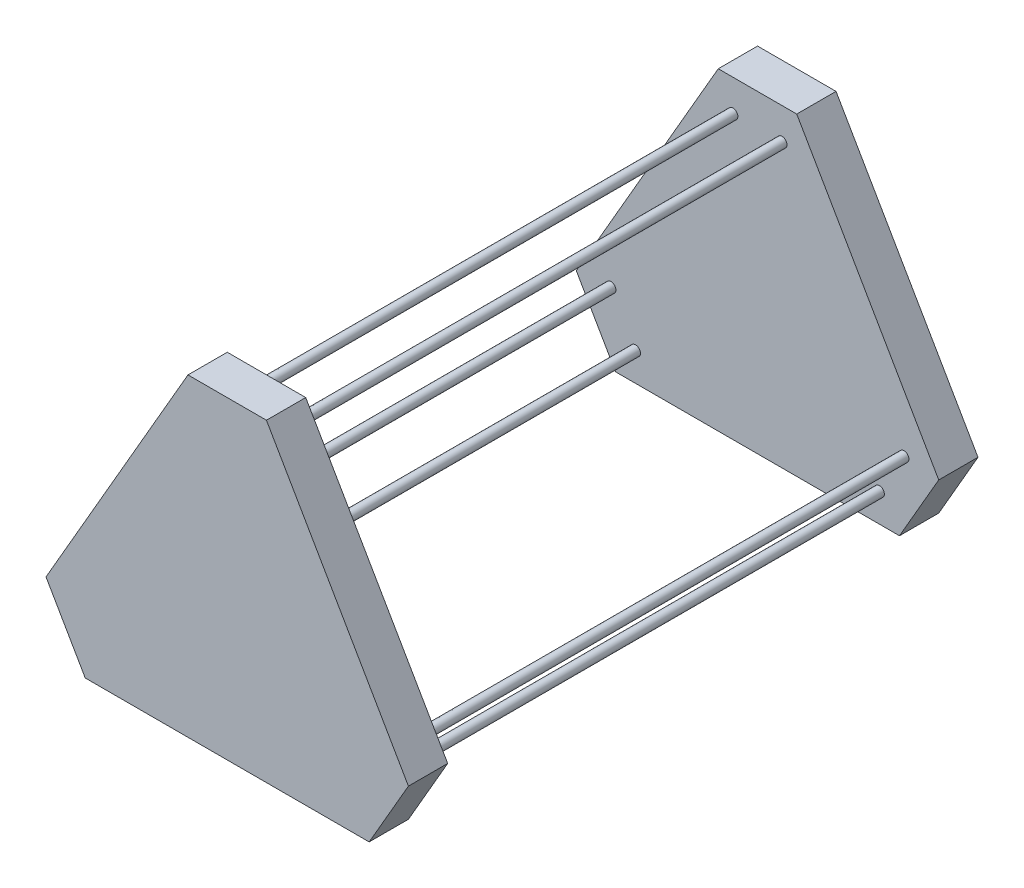
ISO-10303-21;
HEADER;
FILE_DESCRIPTION(('STEP AP214'),'2;1');
FILE_NAME('part.step','',(''),(''),'','','');
FILE_SCHEMA(('AUTOMOTIVE_DESIGN { 1 0 10303 214 1 1 1 1 }'));
ENDSEC;
DATA;
#1=APPLICATION_CONTEXT('core data for automotive mechanical design processes');
#2=APPLICATION_PROTOCOL_DEFINITION('international standard','automotive_design',2000,#1);
#3=PRODUCT_CONTEXT('',#1,'mechanical');
#4=PRODUCT('Part','Part','',(#3));
#5=PRODUCT_RELATED_PRODUCT_CATEGORY('part','',(#4));
#6=PRODUCT_DEFINITION_FORMATION('','',#4);
#7=PRODUCT_DEFINITION_CONTEXT('part definition',#1,'design');
#8=PRODUCT_DEFINITION('design','',#6,#7);
#9=PRODUCT_DEFINITION_SHAPE('','',#8);
#10=(LENGTH_UNIT() NAMED_UNIT(*) SI_UNIT(.MILLI.,.METRE.));
#11=(NAMED_UNIT(*) PLANE_ANGLE_UNIT() SI_UNIT($,.RADIAN.));
#12=(NAMED_UNIT(*) SI_UNIT($,.STERADIAN.) SOLID_ANGLE_UNIT());
#13=UNCERTAINTY_MEASURE_WITH_UNIT(LENGTH_MEASURE(1.E-05),#10,'distance_accuracy_value','');
#14=(GEOMETRIC_REPRESENTATION_CONTEXT(3) GLOBAL_UNCERTAINTY_ASSIGNED_CONTEXT((#13)) GLOBAL_UNIT_ASSIGNED_CONTEXT((#10,
#11,#12)) REPRESENTATION_CONTEXT('',''));
#15=CARTESIAN_POINT('',(0.,0.,0.));
#16=DIRECTION('',(0.,0.,1.));
#17=DIRECTION('',(1.,0.,0.));
#18=AXIS2_PLACEMENT_3D('',#15,#16,#17);
#19=CARTESIAN_POINT('',(-39.9523638439779,190.000000000007,-40.));
#20=DIRECTION('',(0.,1.,0.));
#21=DIRECTION('',(-1.,0.,0.));
#22=AXIS2_PLACEMENT_3D('',#19,#20,#21);
#23=PLANE('',#22);
#24=DIRECTION('',(-1.,0.,0.));
#25=VECTOR('',#24,1.);
#26=CARTESIAN_POINT('',(-39.9523638439779,190.000000000007,0.));
#27=LINE('',#26,#25);
#28=CARTESIAN_POINT('',(39.9523638439782,190.000000000007,0.));
#29=VERTEX_POINT('',#28);
#30=CARTESIAN_POINT('',(-39.9523638439779,190.000000000007,0.));
#31=VERTEX_POINT('',#30);
#32=EDGE_CURVE('E122',#29,#31,#27,.T.);
#33=ORIENTED_EDGE('',*,*,#32,.F.);
#34=DIRECTION('',(0.,0.,1.));
#35=VECTOR('',#34,1.);
#36=CARTESIAN_POINT('',(39.9523638439782,190.000000000007,-40.));
#37=LINE('',#36,#35);
#38=CARTESIAN_POINT('',(39.9523638439782,190.000000000007,-40.));
#39=VERTEX_POINT('',#38);
#40=EDGE_CURVE('E11',#39,#29,#37,.T.);
#41=ORIENTED_EDGE('',*,*,#40,.F.);
#42=DIRECTION('',(-1.,0.,0.));
#43=VECTOR('',#42,1.);
#44=CARTESIAN_POINT('',(-39.9523638439779,190.000000000007,-40.));
#45=LINE('',#44,#43);
#46=CARTESIAN_POINT('',(-39.9523638439779,190.000000000007,-40.));
#47=VERTEX_POINT('',#46);
#48=EDGE_CURVE('E137',#39,#47,#45,.T.);
#49=ORIENTED_EDGE('',*,*,#48,.T.);
#50=DIRECTION('',(0.,0.,1.));
#51=VECTOR('',#50,1.);
#52=CARTESIAN_POINT('',(-39.9523638439779,190.000000000007,-40.));
#53=LINE('',#52,#51);
#54=EDGE_CURVE('E36',#47,#31,#53,.T.);
#55=ORIENTED_EDGE('',*,*,#54,.T.);
#56=EDGE_LOOP('',(#33,#41,#49,#55));
#57=FACE_BOUND('',#56,.T.);
#58=ADVANCED_FACE('F33',(#57),#23,.T.);
#59=CARTESIAN_POINT('',(184.521008641038,-60.4002379698797,-40.));
#60=DIRECTION('',(0.866025403784439,0.5,0.));
#61=DIRECTION('',(-0.5,0.866025403784439,0.));
#62=AXIS2_PLACEMENT_3D('',#59,#60,#61);
#63=PLANE('',#62);
#64=DIRECTION('',(-0.5,0.866025403784439,0.));
#65=VECTOR('',#64,1.);
#66=CARTESIAN_POINT('',(184.521008641038,-60.4002379698797,0.));
#67=LINE('',#66,#65);
#68=CARTESIAN_POINT('',(184.521008641038,-60.4002379698797,0.));
#69=VERTEX_POINT('',#68);
#70=EDGE_CURVE('E135',#69,#29,#67,.T.);
#71=ORIENTED_EDGE('',*,*,#70,.F.);
#72=DIRECTION('',(0.,0.,1.));
#73=VECTOR('',#72,1.);
#74=CARTESIAN_POINT('',(184.521008641038,-60.4002379698797,-40.));
#75=LINE('',#74,#73);
#76=CARTESIAN_POINT('',(184.521008641038,-60.4002379698797,-40.));
#77=VERTEX_POINT('',#76);
#78=EDGE_CURVE('E42',#77,#69,#75,.T.);
#79=ORIENTED_EDGE('',*,*,#78,.F.);
#80=DIRECTION('',(-0.5,0.866025403784439,0.));
#81=VECTOR('',#80,1.);
#82=CARTESIAN_POINT('',(184.521008641038,-60.4002379698797,-40.));
#83=LINE('',#82,#81);
#84=EDGE_CURVE('E112',#77,#39,#83,.T.);
#85=ORIENTED_EDGE('',*,*,#84,.T.);
#86=ORIENTED_EDGE('',*,*,#40,.T.);
#87=EDGE_LOOP('',(#71,#79,#85,#86));
#88=FACE_BOUND('',#87,.T.);
#89=ADVANCED_FACE('F145',(#88),#63,.T.);
#90=CARTESIAN_POINT('',(184.521008641038,-60.4002379698797,-40.));
#91=DIRECTION('',(0.866025403784438,-0.500000000000001,0.));
#92=DIRECTION('',(0.500000000000001,0.866025403784438,0.));
#93=AXIS2_PLACEMENT_3D('',#90,#91,#92);
#94=PLANE('',#93);
#95=DIRECTION('',(0.500000000000001,0.866025403784438,0.));
#96=VECTOR('',#95,1.);
#97=CARTESIAN_POINT('',(184.521008641038,-60.4002379698797,0.));
#98=LINE('',#97,#96);
#99=CARTESIAN_POINT('',(144.56864479706,-129.599762030127,0.));
#100=VERTEX_POINT('',#99);
#101=EDGE_CURVE('E99',#100,#69,#98,.T.);
#102=ORIENTED_EDGE('',*,*,#101,.F.);
#103=DIRECTION('',(0.,0.,1.));
#104=VECTOR('',#103,1.);
#105=CARTESIAN_POINT('',(144.56864479706,-129.599762030127,-40.));
#106=LINE('',#105,#104);
#107=CARTESIAN_POINT('',(144.56864479706,-129.599762030127,-40.));
#108=VERTEX_POINT('',#107);
#109=EDGE_CURVE('E94',#108,#100,#106,.T.);
#110=ORIENTED_EDGE('',*,*,#109,.F.);
#111=DIRECTION('',(0.500000000000001,0.866025403784438,0.));
#112=VECTOR('',#111,1.);
#113=CARTESIAN_POINT('',(184.521008641038,-60.4002379698797,-40.));
#114=LINE('',#113,#112);
#115=EDGE_CURVE('E97',#108,#77,#114,.T.);
#116=ORIENTED_EDGE('',*,*,#115,.T.);
#117=ORIENTED_EDGE('',*,*,#78,.T.);
#118=EDGE_LOOP('',(#102,#110,#116,#117));
#119=FACE_BOUND('',#118,.T.);
#120=ADVANCED_FACE('F96',(#119),#94,.T.);
#121=CARTESIAN_POINT('',(-144.56864479706,-129.599762030127,-40.));
#122=DIRECTION('',(0.,-1.,0.));
#123=DIRECTION('',(0.,0.,-1.));
#124=AXIS2_PLACEMENT_3D('',#121,#122,#123);
#125=PLANE('',#124);
#126=DIRECTION('',(1.,0.,0.));
#127=VECTOR('',#126,1.);
#128=CARTESIAN_POINT('',(-144.56864479706,-129.599762030127,0.));
#129=LINE('',#128,#127);
#130=CARTESIAN_POINT('',(-144.56864479706,-129.599762030127,0.));
#131=VERTEX_POINT('',#130);
#132=EDGE_CURVE('E132',#131,#100,#129,.T.);
#133=ORIENTED_EDGE('',*,*,#132,.F.);
#134=DIRECTION('',(0.,0.,1.));
#135=VECTOR('',#134,1.);
#136=CARTESIAN_POINT('',(-144.56864479706,-129.599762030127,-40.));
#137=LINE('',#136,#135);
#138=CARTESIAN_POINT('',(-144.56864479706,-129.599762030127,-40.));
#139=VERTEX_POINT('',#138);
#140=EDGE_CURVE('E104',#139,#131,#137,.T.);
#141=ORIENTED_EDGE('',*,*,#140,.F.);
#142=DIRECTION('',(1.,0.,0.));
#143=VECTOR('',#142,1.);
#144=CARTESIAN_POINT('',(-144.56864479706,-129.599762030127,-40.));
#145=LINE('',#144,#143);
#146=EDGE_CURVE('E110',#139,#108,#145,.T.);
#147=ORIENTED_EDGE('',*,*,#146,.T.);
#148=ORIENTED_EDGE('',*,*,#109,.T.);
#149=EDGE_LOOP('',(#133,#141,#147,#148));
#150=FACE_BOUND('',#149,.T.);
#151=ADVANCED_FACE('F114',(#150),#125,.T.);
#152=CARTESIAN_POINT('',(-144.56864479706,-129.599762030127,-40.));
#153=DIRECTION('',(-0.866025403784439,-0.5,0.));
#154=DIRECTION('',(0.5,-0.866025403784439,0.));
#155=AXIS2_PLACEMENT_3D('',#152,#153,#154);
#156=PLANE('',#155);
#157=DIRECTION('',(0.5,-0.866025403784439,0.));
#158=VECTOR('',#157,1.);
#159=CARTESIAN_POINT('',(-144.56864479706,-129.599762030127,0.));
#160=LINE('',#159,#158);
#161=CARTESIAN_POINT('',(-184.521008641038,-60.4002379698796,0.));
#162=VERTEX_POINT('',#161);
#163=EDGE_CURVE('E129',#162,#131,#160,.T.);
#164=ORIENTED_EDGE('',*,*,#163,.F.);
#165=DIRECTION('',(0.,0.,1.));
#166=VECTOR('',#165,1.);
#167=CARTESIAN_POINT('',(-184.521008641038,-60.4002379698796,-40.));
#168=LINE('',#167,#166);
#169=CARTESIAN_POINT('',(-184.521008641038,-60.4002379698796,-40.));
#170=VERTEX_POINT('',#169);
#171=EDGE_CURVE('E140',#170,#162,#168,.T.);
#172=ORIENTED_EDGE('',*,*,#171,.F.);
#173=DIRECTION('',(0.5,-0.866025403784439,0.));
#174=VECTOR('',#173,1.);
#175=CARTESIAN_POINT('',(-144.56864479706,-129.599762030127,-40.));
#176=LINE('',#175,#174);
#177=EDGE_CURVE('E115',#170,#139,#176,.T.);
#178=ORIENTED_EDGE('',*,*,#177,.T.);
#179=ORIENTED_EDGE('',*,*,#140,.T.);
#180=EDGE_LOOP('',(#164,#172,#178,#179));
#181=FACE_BOUND('',#180,.T.);
#182=ADVANCED_FACE('F158',(#181),#156,.T.);
#183=CARTESIAN_POINT('',(-39.9523638439779,190.000000000007,-40.));
#184=DIRECTION('',(-0.866025403784438,0.5,0.));
#185=DIRECTION('',(-0.5,-0.866025403784439,0.));
#186=AXIS2_PLACEMENT_3D('',#183,#184,#185);
#187=PLANE('',#186);
#188=DIRECTION('',(-0.5,-0.866025403784438,0.));
#189=VECTOR('',#188,1.);
#190=CARTESIAN_POINT('',(-39.9523638439779,190.000000000007,0.));
#191=LINE('',#190,#189);
#192=EDGE_CURVE('E125',#31,#162,#191,.T.);
#193=ORIENTED_EDGE('',*,*,#192,.F.);
#194=ORIENTED_EDGE('',*,*,#54,.F.);
#195=DIRECTION('',(-0.5,-0.866025403784438,0.));
#196=VECTOR('',#195,1.);
#197=CARTESIAN_POINT('',(-39.9523638439779,190.000000000007,-40.));
#198=LINE('',#197,#196);
#199=EDGE_CURVE('E117',#47,#170,#198,.T.);
#200=ORIENTED_EDGE('',*,*,#199,.T.);
#201=ORIENTED_EDGE('',*,*,#171,.T.);
#202=EDGE_LOOP('',(#193,#194,#200,#201));
#203=FACE_BOUND('',#202,.T.);
#204=ADVANCED_FACE('F142',(#203),#187,.T.);
#205=CARTESIAN_POINT('',(0.,0.,-40.));
#206=DIRECTION('',(0.,0.,1.));
#207=DIRECTION('',(1.,0.,0.));
#208=AXIS2_PLACEMENT_3D('',#205,#206,#207);
#209=PLANE('',#208);
#210=ORIENTED_EDGE('',*,*,#48,.F.);
#211=ORIENTED_EDGE('',*,*,#84,.F.);
#212=ORIENTED_EDGE('',*,*,#115,.F.);
#213=ORIENTED_EDGE('',*,*,#146,.F.);
#214=ORIENTED_EDGE('',*,*,#177,.F.);
#215=ORIENTED_EDGE('',*,*,#199,.F.);
#216=EDGE_LOOP('',(#210,#211,#212,#213,#214,#215));
#217=FACE_BOUND('',#216,.T.);
#218=ADVANCED_FACE('F108',(#217),#209,.F.);
#219=CARTESIAN_POINT('',(0.,0.,0.));
#220=DIRECTION('',(0.,0.,1.));
#221=DIRECTION('',(1.,0.,0.));
#222=AXIS2_PLACEMENT_3D('',#219,#220,#221);
#223=PLANE('',#222);
#224=CARTESIAN_POINT('',(-124.194433750291,-100.571203217078,0.));
#225=DIRECTION('',(0.,0.,1.));
#226=DIRECTION('',(1.,0.,0.));
#227=AXIS2_PLACEMENT_3D('',#224,#225,#226);
#228=CIRCLE('',#227,5.0000000000132);
#229=CARTESIAN_POINT('',(-119.194433750278,-100.571203217078,0.));
#230=VERTEX_POINT('',#229);
#231=EDGE_CURVE('E253',#230,#230,#228,.T.);
#232=ORIENTED_EDGE('',*,*,#231,.F.);
#233=EDGE_LOOP('',(#232));
#234=FACE_BOUND('',#233,.T.);
#235=CARTESIAN_POINT('',(-149.194433750291,-57.2699330278556,0.));
#236=DIRECTION('',(0.,0.,1.));
#237=DIRECTION('',(1.,0.,0.));
#238=AXIS2_PLACEMENT_3D('',#235,#236,#237);
#239=CIRCLE('',#238,5.00000000001306);
#240=CARTESIAN_POINT('',(-144.194433750278,-57.2699330278556,0.));
#241=VERTEX_POINT('',#240);
#242=EDGE_CURVE('E276',#241,#241,#239,.T.);
#243=ORIENTED_EDGE('',*,*,#242,.F.);
#244=EDGE_LOOP('',(#243));
#245=FACE_BOUND('',#244,.T.);
#246=CARTESIAN_POINT('',(149.194433750311,-57.269933027844,0.));
#247=DIRECTION('',(0.,0.,1.));
#248=DIRECTION('',(1.,0.,0.));
#249=AXIS2_PLACEMENT_3D('',#246,#247,#248);
#250=CIRCLE('',#249,5.00000000000728);
#251=CARTESIAN_POINT('',(154.194433750318,-57.269933027844,0.));
#252=VERTEX_POINT('',#251);
#253=EDGE_CURVE('E281',#252,#252,#250,.T.);
#254=ORIENTED_EDGE('',*,*,#253,.F.);
#255=EDGE_LOOP('',(#254));
#256=FACE_BOUND('',#255,.T.);
#257=CARTESIAN_POINT('',(124.194433750311,-100.571203217066,0.));
#258=DIRECTION('',(0.,0.,1.));
#259=DIRECTION('',(1.,0.,0.));
#260=AXIS2_PLACEMENT_3D('',#257,#258,#259);
#261=CIRCLE('',#260,5.00000000000721);
#262=CARTESIAN_POINT('',(129.194433750318,-100.571203217066,0.));
#263=VERTEX_POINT('',#262);
#264=EDGE_CURVE('E287',#263,#263,#261,.T.);
#265=ORIENTED_EDGE('',*,*,#264,.F.);
#266=EDGE_LOOP('',(#265));
#267=FACE_BOUND('',#266,.T.);
#268=CARTESIAN_POINT('',(-25.,157.841136244918,0.));
#269=DIRECTION('',(0.,0.,1.));
#270=DIRECTION('',(1.,0.,0.));
#271=AXIS2_PLACEMENT_3D('',#268,#269,#270);
#272=CIRCLE('',#271,5.);
#273=CARTESIAN_POINT('',(-20.,157.841136244918,0.));
#274=VERTEX_POINT('',#273);
#275=EDGE_CURVE('E293',#274,#274,#272,.T.);
#276=ORIENTED_EDGE('',*,*,#275,.F.);
#277=EDGE_LOOP('',(#276));
#278=FACE_BOUND('',#277,.T.);
#279=CARTESIAN_POINT('',(25.,157.841136244918,0.));
#280=DIRECTION('',(0.,0.,1.));
#281=DIRECTION('',(1.,0.,0.));
#282=AXIS2_PLACEMENT_3D('',#279,#280,#281);
#283=CIRCLE('',#282,5.);
#284=CARTESIAN_POINT('',(30.,157.841136244918,0.));
#285=VERTEX_POINT('',#284);
#286=EDGE_CURVE('E299',#285,#285,#283,.T.);
#287=ORIENTED_EDGE('',*,*,#286,.F.);
#288=EDGE_LOOP('',(#287));
#289=FACE_BOUND('',#288,.T.);
#290=ORIENTED_EDGE('',*,*,#32,.T.);
#291=ORIENTED_EDGE('',*,*,#192,.T.);
#292=ORIENTED_EDGE('',*,*,#163,.T.);
#293=ORIENTED_EDGE('',*,*,#132,.T.);
#294=ORIENTED_EDGE('',*,*,#101,.T.);
#295=ORIENTED_EDGE('',*,*,#70,.T.);
#296=EDGE_LOOP('',(#290,#291,#292,#293,#294,#295));
#297=FACE_BOUND('',#296,.T.);
#298=ADVANCED_FACE('F144',(#234,#245,#256,#267,#278,#289,#297),#223,.T.);
#299=CARTESIAN_POINT('',(25.,157.841136244918,500.));
#300=DIRECTION('',(0.,0.,-1.));
#301=DIRECTION('',(-1.,0.,0.));
#302=AXIS2_PLACEMENT_3D('',#299,#300,#301);
#303=CYLINDRICAL_SURFACE('',#302,5.);
#304=CARTESIAN_POINT('',(25.,157.841136244918,500.));
#305=DIRECTION('',(0.,0.,1.));
#306=DIRECTION('',(1.,0.,0.));
#307=AXIS2_PLACEMENT_3D('',#304,#305,#306);
#308=CIRCLE('',#307,5.);
#309=CARTESIAN_POINT('',(30.,157.841136244918,500.));
#310=VERTEX_POINT('',#309);
#311=EDGE_CURVE('E126',#310,#310,#308,.T.);
#312=ORIENTED_EDGE('',*,*,#311,.F.);
#313=EDGE_LOOP('',(#312));
#314=FACE_BOUND('',#313,.T.);
#315=ORIENTED_EDGE('',*,*,#286,.T.);
#316=EDGE_LOOP('',(#315));
#317=FACE_BOUND('',#316,.T.);
#318=ADVANCED_FACE('F168',(#314,#317),#303,.T.);
#319=CARTESIAN_POINT('',(-25.,157.841136244918,500.));
#320=DIRECTION('',(0.,0.,-1.));
#321=DIRECTION('',(-1.,0.,0.));
#322=AXIS2_PLACEMENT_3D('',#319,#320,#321);
#323=CYLINDRICAL_SURFACE('',#322,5.);
#324=CARTESIAN_POINT('',(-25.,157.841136244918,500.));
#325=DIRECTION('',(0.,0.,1.));
#326=DIRECTION('',(1.,0.,0.));
#327=AXIS2_PLACEMENT_3D('',#324,#325,#326);
#328=CIRCLE('',#327,5.);
#329=CARTESIAN_POINT('',(-20.,157.841136244918,500.));
#330=VERTEX_POINT('',#329);
#331=EDGE_CURVE('E296',#330,#330,#328,.T.);
#332=ORIENTED_EDGE('',*,*,#331,.F.);
#333=EDGE_LOOP('',(#332));
#334=FACE_BOUND('',#333,.T.);
#335=ORIENTED_EDGE('',*,*,#275,.T.);
#336=EDGE_LOOP('',(#335));
#337=FACE_BOUND('',#336,.T.);
#338=ADVANCED_FACE('F173',(#334,#337),#323,.T.);
#339=CARTESIAN_POINT('',(124.194433750311,-100.571203217066,500.));
#340=DIRECTION('',(0.,0.,-1.));
#341=DIRECTION('',(-1.,0.,0.));
#342=AXIS2_PLACEMENT_3D('',#339,#340,#341);
#343=CYLINDRICAL_SURFACE('',#342,5.00000000000721);
#344=CARTESIAN_POINT('',(124.194433750311,-100.571203217066,500.));
#345=DIRECTION('',(0.,0.,1.));
#346=DIRECTION('',(1.,0.,0.));
#347=AXIS2_PLACEMENT_3D('',#344,#345,#346);
#348=CIRCLE('',#347,5.00000000000721);
#349=CARTESIAN_POINT('',(129.194433750318,-100.571203217066,500.));
#350=VERTEX_POINT('',#349);
#351=EDGE_CURVE('E290',#350,#350,#348,.T.);
#352=ORIENTED_EDGE('',*,*,#351,.F.);
#353=EDGE_LOOP('',(#352));
#354=FACE_BOUND('',#353,.T.);
#355=ORIENTED_EDGE('',*,*,#264,.T.);
#356=EDGE_LOOP('',(#355));
#357=FACE_BOUND('',#356,.T.);
#358=ADVANCED_FACE('F177',(#354,#357),#343,.T.);
#359=CARTESIAN_POINT('',(149.194433750311,-57.269933027844,500.));
#360=DIRECTION('',(0.,0.,-1.));
#361=DIRECTION('',(-1.,0.,0.));
#362=AXIS2_PLACEMENT_3D('',#359,#360,#361);
#363=CYLINDRICAL_SURFACE('',#362,5.00000000000728);
#364=CARTESIAN_POINT('',(149.194433750311,-57.269933027844,500.));
#365=DIRECTION('',(0.,0.,1.));
#366=DIRECTION('',(1.,0.,0.));
#367=AXIS2_PLACEMENT_3D('',#364,#365,#366);
#368=CIRCLE('',#367,5.00000000000728);
#369=CARTESIAN_POINT('',(154.194433750318,-57.269933027844,500.));
#370=VERTEX_POINT('',#369);
#371=EDGE_CURVE('E284',#370,#370,#368,.T.);
#372=ORIENTED_EDGE('',*,*,#371,.F.);
#373=EDGE_LOOP('',(#372));
#374=FACE_BOUND('',#373,.T.);
#375=ORIENTED_EDGE('',*,*,#253,.T.);
#376=EDGE_LOOP('',(#375));
#377=FACE_BOUND('',#376,.T.);
#378=ADVANCED_FACE('F181',(#374,#377),#363,.T.);
#379=CARTESIAN_POINT('',(-149.194433750291,-57.2699330278556,500.));
#380=DIRECTION('',(0.,0.,-1.));
#381=DIRECTION('',(-1.,0.,0.));
#382=AXIS2_PLACEMENT_3D('',#379,#380,#381);
#383=CYLINDRICAL_SURFACE('',#382,5.00000000001306);
#384=CARTESIAN_POINT('',(-149.194433750291,-57.2699330278556,500.));
#385=DIRECTION('',(0.,0.,1.));
#386=DIRECTION('',(1.,0.,0.));
#387=AXIS2_PLACEMENT_3D('',#384,#385,#386);
#388=CIRCLE('',#387,5.00000000001306);
#389=CARTESIAN_POINT('',(-144.194433750278,-57.2699330278556,500.));
#390=VERTEX_POINT('',#389);
#391=EDGE_CURVE('E278',#390,#390,#388,.T.);
#392=ORIENTED_EDGE('',*,*,#391,.F.);
#393=EDGE_LOOP('',(#392));
#394=FACE_BOUND('',#393,.T.);
#395=ORIENTED_EDGE('',*,*,#242,.T.);
#396=EDGE_LOOP('',(#395));
#397=FACE_BOUND('',#396,.T.);
#398=ADVANCED_FACE('F185',(#394,#397),#383,.T.);
#399=CARTESIAN_POINT('',(-124.194433750291,-100.571203217078,500.));
#400=DIRECTION('',(0.,0.,-1.));
#401=DIRECTION('',(-1.,0.,0.));
#402=AXIS2_PLACEMENT_3D('',#399,#400,#401);
#403=CYLINDRICAL_SURFACE('',#402,5.0000000000132);
#404=CARTESIAN_POINT('',(-124.194433750291,-100.571203217078,500.));
#405=DIRECTION('',(0.,0.,1.));
#406=DIRECTION('',(1.,0.,0.));
#407=AXIS2_PLACEMENT_3D('',#404,#405,#406);
#408=CIRCLE('',#407,5.0000000000132);
#409=CARTESIAN_POINT('',(-119.194433750278,-100.571203217078,500.));
#410=VERTEX_POINT('',#409);
#411=EDGE_CURVE('E257',#410,#410,#408,.T.);
#412=ORIENTED_EDGE('',*,*,#411,.F.);
#413=EDGE_LOOP('',(#412));
#414=FACE_BOUND('',#413,.T.);
#415=ORIENTED_EDGE('',*,*,#231,.T.);
#416=EDGE_LOOP('',(#415));
#417=FACE_BOUND('',#416,.T.);
#418=ADVANCED_FACE('F189',(#414,#417),#403,.T.);
#419=CARTESIAN_POINT('',(-39.9523638439779,190.000000000007,540.));
#420=DIRECTION('',(0.,-1.,0.));
#421=DIRECTION('',(1.,0.,0.));
#422=AXIS2_PLACEMENT_3D('',#419,#420,#421);
#423=PLANE('',#422);
#424=DIRECTION('',(-1.,0.,0.));
#425=VECTOR('',#424,1.);
#426=CARTESIAN_POINT('',(-39.9523638439779,190.000000000007,500.));
#427=LINE('',#426,#425);
#428=CARTESIAN_POINT('',(39.9523638439782,190.000000000007,500.));
#429=VERTEX_POINT('',#428);
#430=CARTESIAN_POINT('',(-39.9523638439779,190.000000000007,500.));
#431=VERTEX_POINT('',#430);
#432=EDGE_CURVE('E251',#429,#431,#427,.T.);
#433=ORIENTED_EDGE('',*,*,#432,.T.);
#434=DIRECTION('',(0.,0.,-1.));
#435=VECTOR('',#434,1.);
#436=CARTESIAN_POINT('',(-39.9523638439779,190.000000000007,540.));
#437=LINE('',#436,#435);
#438=CARTESIAN_POINT('',(-39.9523638439779,190.000000000007,540.));
#439=VERTEX_POINT('',#438);
#440=EDGE_CURVE('E249',#439,#431,#437,.T.);
#441=ORIENTED_EDGE('',*,*,#440,.F.);
#442=DIRECTION('',(-1.,0.,0.));
#443=VECTOR('',#442,1.);
#444=CARTESIAN_POINT('',(-39.9523638439779,190.000000000007,540.));
#445=LINE('',#444,#443);
#446=CARTESIAN_POINT('',(39.9523638439782,190.000000000007,540.));
#447=VERTEX_POINT('',#446);
#448=EDGE_CURVE('E231',#447,#439,#445,.T.);
#449=ORIENTED_EDGE('',*,*,#448,.F.);
#450=DIRECTION('',(0.,0.,-1.));
#451=VECTOR('',#450,1.);
#452=CARTESIAN_POINT('',(39.9523638439782,190.000000000007,540.));
#453=LINE('',#452,#451);
#454=EDGE_CURVE('E273',#447,#429,#453,.T.);
#455=ORIENTED_EDGE('',*,*,#454,.T.);
#456=EDGE_LOOP('',(#433,#441,#449,#455));
#457=FACE_BOUND('',#456,.T.);
#458=ADVANCED_FACE('F193',(#457),#423,.F.);
#459=CARTESIAN_POINT('',(-39.9523638439779,190.000000000007,540.));
#460=DIRECTION('',(0.866025403784438,-0.5,0.));
#461=DIRECTION('',(0.5,0.866025403784439,0.));
#462=AXIS2_PLACEMENT_3D('',#459,#460,#461);
#463=PLANE('',#462);
#464=DIRECTION('',(-0.5,-0.866025403784438,0.));
#465=VECTOR('',#464,1.);
#466=CARTESIAN_POINT('',(-39.9523638439779,190.000000000007,500.));
#467=LINE('',#466,#465);
#468=CARTESIAN_POINT('',(-184.521008641038,-60.4002379698796,500.));
#469=VERTEX_POINT('',#468);
#470=EDGE_CURVE('E245',#431,#469,#467,.T.);
#471=ORIENTED_EDGE('',*,*,#470,.T.);
#472=DIRECTION('',(0.,0.,-1.));
#473=VECTOR('',#472,1.);
#474=CARTESIAN_POINT('',(-184.521008641038,-60.4002379698796,540.));
#475=LINE('',#474,#473);
#476=CARTESIAN_POINT('',(-184.521008641038,-60.4002379698796,540.));
#477=VERTEX_POINT('',#476);
#478=EDGE_CURVE('E254',#477,#469,#475,.T.);
#479=ORIENTED_EDGE('',*,*,#478,.F.);
#480=DIRECTION('',(-0.5,-0.866025403784438,0.));
#481=VECTOR('',#480,1.);
#482=CARTESIAN_POINT('',(-39.9523638439779,190.000000000007,540.));
#483=LINE('',#482,#481);
#484=EDGE_CURVE('E236',#439,#477,#483,.T.);
#485=ORIENTED_EDGE('',*,*,#484,.F.);
#486=ORIENTED_EDGE('',*,*,#440,.T.);
#487=EDGE_LOOP('',(#471,#479,#485,#486));
#488=FACE_BOUND('',#487,.T.);
#489=ADVANCED_FACE('F197',(#488),#463,.F.);
#490=CARTESIAN_POINT('',(-144.56864479706,-129.599762030127,540.));
#491=DIRECTION('',(0.866025403784439,0.5,0.));
#492=DIRECTION('',(-0.5,0.866025403784439,0.));
#493=AXIS2_PLACEMENT_3D('',#490,#491,#492);
#494=PLANE('',#493);
#495=DIRECTION('',(0.5,-0.866025403784439,0.));
#496=VECTOR('',#495,1.);
#497=CARTESIAN_POINT('',(-144.56864479706,-129.599762030127,500.));
#498=LINE('',#497,#496);
#499=CARTESIAN_POINT('',(-144.56864479706,-129.599762030127,500.));
#500=VERTEX_POINT('',#499);
#501=EDGE_CURVE('E340',#469,#500,#498,.T.);
#502=ORIENTED_EDGE('',*,*,#501,.T.);
#503=DIRECTION('',(0.,0.,-1.));
#504=VECTOR('',#503,1.);
#505=CARTESIAN_POINT('',(-144.56864479706,-129.599762030127,540.));
#506=LINE('',#505,#504);
#507=CARTESIAN_POINT('',(-144.56864479706,-129.599762030127,540.));
#508=VERTEX_POINT('',#507);
#509=EDGE_CURVE('E260',#508,#500,#506,.T.);
#510=ORIENTED_EDGE('',*,*,#509,.F.);
#511=DIRECTION('',(0.5,-0.866025403784439,0.));
#512=VECTOR('',#511,1.);
#513=CARTESIAN_POINT('',(-144.56864479706,-129.599762030127,540.));
#514=LINE('',#513,#512);
#515=EDGE_CURVE('E346',#477,#508,#514,.T.);
#516=ORIENTED_EDGE('',*,*,#515,.F.);
#517=ORIENTED_EDGE('',*,*,#478,.T.);
#518=EDGE_LOOP('',(#502,#510,#516,#517));
#519=FACE_BOUND('',#518,.T.);
#520=ADVANCED_FACE('F211',(#519),#494,.F.);
#521=CARTESIAN_POINT('',(-144.56864479706,-129.599762030127,540.));
#522=DIRECTION('',(0.,1.,0.));
#523=DIRECTION('',(0.,0.,1.));
#524=AXIS2_PLACEMENT_3D('',#521,#522,#523);
#525=PLANE('',#524);
#526=DIRECTION('',(1.,0.,0.));
#527=VECTOR('',#526,1.);
#528=CARTESIAN_POINT('',(-144.56864479706,-129.599762030127,500.));
#529=LINE('',#528,#527);
#530=CARTESIAN_POINT('',(144.56864479706,-129.599762030127,500.));
#531=VERTEX_POINT('',#530);
#532=EDGE_CURVE('E338',#500,#531,#529,.T.);
#533=ORIENTED_EDGE('',*,*,#532,.T.);
#534=DIRECTION('',(0.,0.,-1.));
#535=VECTOR('',#534,1.);
#536=CARTESIAN_POINT('',(144.56864479706,-129.599762030127,540.));
#537=LINE('',#536,#535);
#538=CARTESIAN_POINT('',(144.56864479706,-129.599762030127,540.));
#539=VERTEX_POINT('',#538);
#540=EDGE_CURVE('E267',#539,#531,#537,.T.);
#541=ORIENTED_EDGE('',*,*,#540,.F.);
#542=DIRECTION('',(1.,0.,0.));
#543=VECTOR('',#542,1.);
#544=CARTESIAN_POINT('',(-144.56864479706,-129.599762030127,540.));
#545=LINE('',#544,#543);
#546=EDGE_CURVE('E361',#508,#539,#545,.T.);
#547=ORIENTED_EDGE('',*,*,#546,.F.);
#548=ORIENTED_EDGE('',*,*,#509,.T.);
#549=EDGE_LOOP('',(#533,#541,#547,#548));
#550=FACE_BOUND('',#549,.T.);
#551=ADVANCED_FACE('F207',(#550),#525,.F.);
#552=CARTESIAN_POINT('',(184.521008641038,-60.4002379698797,540.));
#553=DIRECTION('',(-0.866025403784438,0.500000000000001,0.));
#554=DIRECTION('',(-0.500000000000001,-0.866025403784438,0.));
#555=AXIS2_PLACEMENT_3D('',#552,#553,#554);
#556=PLANE('',#555);
#557=DIRECTION('',(0.500000000000001,0.866025403784438,0.));
#558=VECTOR('',#557,1.);
#559=CARTESIAN_POINT('',(184.521008641038,-60.4002379698797,500.));
#560=LINE('',#559,#558);
#561=CARTESIAN_POINT('',(184.521008641038,-60.4002379698797,500.));
#562=VERTEX_POINT('',#561);
#563=EDGE_CURVE('E331',#531,#562,#560,.T.);
#564=ORIENTED_EDGE('',*,*,#563,.T.);
#565=DIRECTION('',(0.,0.,-1.));
#566=VECTOR('',#565,1.);
#567=CARTESIAN_POINT('',(184.521008641038,-60.4002379698797,540.));
#568=LINE('',#567,#566);
#569=CARTESIAN_POINT('',(184.521008641038,-60.4002379698797,540.));
#570=VERTEX_POINT('',#569);
#571=EDGE_CURVE('E270',#570,#562,#568,.T.);
#572=ORIENTED_EDGE('',*,*,#571,.F.);
#573=DIRECTION('',(0.500000000000001,0.866025403784438,0.));
#574=VECTOR('',#573,1.);
#575=CARTESIAN_POINT('',(184.521008641038,-60.4002379698797,540.));
#576=LINE('',#575,#574);
#577=EDGE_CURVE('E356',#539,#570,#576,.T.);
#578=ORIENTED_EDGE('',*,*,#577,.F.);
#579=ORIENTED_EDGE('',*,*,#540,.T.);
#580=EDGE_LOOP('',(#564,#572,#578,#579));
#581=FACE_BOUND('',#580,.T.);
#582=ADVANCED_FACE('F203',(#581),#556,.F.);
#583=CARTESIAN_POINT('',(184.521008641038,-60.4002379698797,540.));
#584=DIRECTION('',(-0.866025403784439,-0.5,0.));
#585=DIRECTION('',(0.5,-0.866025403784439,0.));
#586=AXIS2_PLACEMENT_3D('',#583,#584,#585);
#587=PLANE('',#586);
#588=DIRECTION('',(-0.5,0.866025403784439,0.));
#589=VECTOR('',#588,1.);
#590=CARTESIAN_POINT('',(184.521008641038,-60.4002379698797,500.));
#591=LINE('',#590,#589);
#592=EDGE_CURVE('E327',#562,#429,#591,.T.);
#593=ORIENTED_EDGE('',*,*,#592,.T.);
#594=ORIENTED_EDGE('',*,*,#454,.F.);
#595=DIRECTION('',(-0.5,0.866025403784439,0.));
#596=VECTOR('',#595,1.);
#597=CARTESIAN_POINT('',(184.521008641038,-60.4002379698797,540.));
#598=LINE('',#597,#596);
#599=EDGE_CURVE('E241',#570,#447,#598,.T.);
#600=ORIENTED_EDGE('',*,*,#599,.F.);
#601=ORIENTED_EDGE('',*,*,#571,.T.);
#602=EDGE_LOOP('',(#593,#594,#600,#601));
#603=FACE_BOUND('',#602,.T.);
#604=ADVANCED_FACE('F199',(#603),#587,.F.);
#605=CARTESIAN_POINT('',(0.,0.,540.));
#606=DIRECTION('',(0.,0.,-1.));
#607=DIRECTION('',(1.,0.,0.));
#608=AXIS2_PLACEMENT_3D('',#605,#606,#607);
#609=PLANE('',#608);
#610=ORIENTED_EDGE('',*,*,#448,.T.);
#611=ORIENTED_EDGE('',*,*,#484,.T.);
#612=ORIENTED_EDGE('',*,*,#515,.T.);
#613=ORIENTED_EDGE('',*,*,#546,.T.);
#614=ORIENTED_EDGE('',*,*,#577,.T.);
#615=ORIENTED_EDGE('',*,*,#599,.T.);
#616=EDGE_LOOP('',(#610,#611,#612,#613,#614,#615));
#617=FACE_BOUND('',#616,.T.);
#618=ADVANCED_FACE('F202',(#617),#609,.F.);
#619=CARTESIAN_POINT('',(0.,0.,500.));
#620=DIRECTION('',(0.,0.,-1.));
#621=DIRECTION('',(1.,0.,0.));
#622=AXIS2_PLACEMENT_3D('',#619,#620,#621);
#623=PLANE('',#622);
#624=ORIENTED_EDGE('',*,*,#311,.T.);
#625=EDGE_LOOP('',(#624));
#626=FACE_BOUND('',#625,.T.);
#627=ORIENTED_EDGE('',*,*,#331,.T.);
#628=EDGE_LOOP('',(#627));
#629=FACE_BOUND('',#628,.T.);
#630=ORIENTED_EDGE('',*,*,#351,.T.);
#631=EDGE_LOOP('',(#630));
#632=FACE_BOUND('',#631,.T.);
#633=ORIENTED_EDGE('',*,*,#371,.T.);
#634=EDGE_LOOP('',(#633));
#635=FACE_BOUND('',#634,.T.);
#636=ORIENTED_EDGE('',*,*,#391,.T.);
#637=EDGE_LOOP('',(#636));
#638=FACE_BOUND('',#637,.T.);
#639=ORIENTED_EDGE('',*,*,#411,.T.);
#640=EDGE_LOOP('',(#639));
#641=FACE_BOUND('',#640,.T.);
#642=ORIENTED_EDGE('',*,*,#432,.F.);
#643=ORIENTED_EDGE('',*,*,#592,.F.);
#644=ORIENTED_EDGE('',*,*,#563,.F.);
#645=ORIENTED_EDGE('',*,*,#532,.F.);
#646=ORIENTED_EDGE('',*,*,#501,.F.);
#647=ORIENTED_EDGE('',*,*,#470,.F.);
#648=EDGE_LOOP('',(#642,#643,#644,#645,#646,#647));
#649=FACE_BOUND('',#648,.T.);
#650=ADVANCED_FACE('F219',(#626,#629,#632,#635,#638,#641,#649),#623,.T.);
#651=CLOSED_SHELL('',(#58,#89,#120,#151,#182,#204,#218,#298,#318,#338,#358,#378,#398,#418,#458,
#489,#520,#551,#582,#604,#618,#650));
#652=MANIFOLD_SOLID_BREP('B2',#651);
#653=ADVANCED_BREP_SHAPE_REPRESENTATION('',(#18,#652),#14);
#654=SHAPE_DEFINITION_REPRESENTATION(#9,#653);
ENDSEC;
END-ISO-10303-21;
